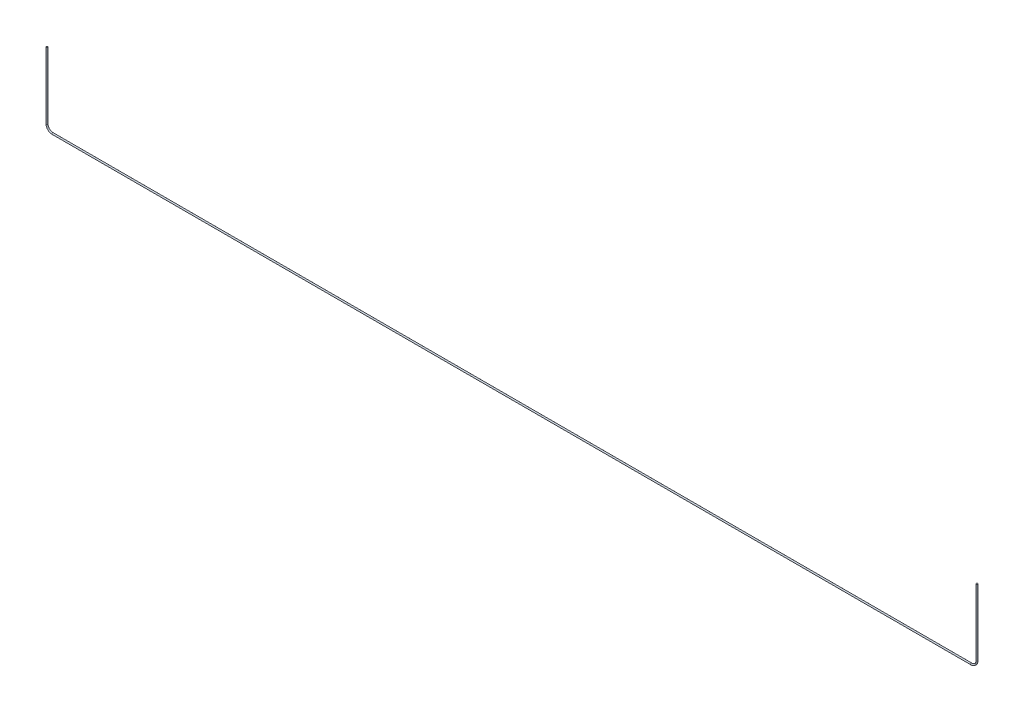
ISO-10303-21;
HEADER;
FILE_DESCRIPTION(('STEP AP214'),'2;1');
FILE_NAME('part.step','',(''),(''),'','','');
FILE_SCHEMA(('AUTOMOTIVE_DESIGN { 1 0 10303 214 1 1 1 1 }'));
ENDSEC;
DATA;
#1=APPLICATION_CONTEXT('core data for automotive mechanical design processes');
#2=APPLICATION_PROTOCOL_DEFINITION('international standard','automotive_design',2000,#1);
#3=PRODUCT_CONTEXT('',#1,'mechanical');
#4=PRODUCT('Part','Part','',(#3));
#5=PRODUCT_RELATED_PRODUCT_CATEGORY('part','',(#4));
#6=PRODUCT_DEFINITION_FORMATION('','',#4);
#7=PRODUCT_DEFINITION_CONTEXT('part definition',#1,'design');
#8=PRODUCT_DEFINITION('design','',#6,#7);
#9=PRODUCT_DEFINITION_SHAPE('','',#8);
#10=(LENGTH_UNIT() NAMED_UNIT(*) SI_UNIT(.MILLI.,.METRE.));
#11=(NAMED_UNIT(*) PLANE_ANGLE_UNIT() SI_UNIT($,.RADIAN.));
#12=(NAMED_UNIT(*) SI_UNIT($,.STERADIAN.) SOLID_ANGLE_UNIT());
#13=UNCERTAINTY_MEASURE_WITH_UNIT(LENGTH_MEASURE(1.E-05),#10,'distance_accuracy_value','');
#14=(GEOMETRIC_REPRESENTATION_CONTEXT(3) GLOBAL_UNCERTAINTY_ASSIGNED_CONTEXT((#13)) GLOBAL_UNIT_ASSIGNED_CONTEXT((#10,
#11,#12)) REPRESENTATION_CONTEXT('',''));
#15=CARTESIAN_POINT('',(0.,0.,0.));
#16=DIRECTION('',(0.,0.,1.));
#17=DIRECTION('',(1.,0.,0.));
#18=AXIS2_PLACEMENT_3D('',#15,#16,#17);
#19=CARTESIAN_POINT('',(-4120.,639.999999999999,0.));
#20=DIRECTION('',(0.,1.,0.));
#21=DIRECTION('',(0.,0.,-1.));
#22=AXIS2_PLACEMENT_3D('',#19,#20,#21);
#23=PLANE('',#22);
#24=CARTESIAN_POINT('',(-4120.,639.999999999999,0.));
#25=DIRECTION('',(0.,1.,0.));
#26=DIRECTION('',(0.,0.,-1.));
#27=AXIS2_PLACEMENT_3D('',#24,#25,#26);
#28=CIRCLE('',#27,6.3500000000003);
#29=CARTESIAN_POINT('',(-4120.,639.999999999999,-6.3500000000003));
#30=VERTEX_POINT('',#29);
#31=EDGE_CURVE('E69',#30,#30,#28,.T.);
#32=ORIENTED_EDGE('',*,*,#31,.T.);
#33=EDGE_LOOP('',(#32));
#34=FACE_BOUND('',#33,.T.);
#35=ADVANCED_FACE('F47',(#34),#23,.T.);
#36=CARTESIAN_POINT('',(4120.,639.999999999999,0.));
#37=DIRECTION('',(0.,-1.,0.));
#38=DIRECTION('',(0.,0.,-1.));
#39=AXIS2_PLACEMENT_3D('',#36,#37,#38);
#40=PLANE('',#39);
#41=CARTESIAN_POINT('',(4120.,639.999999999999,0.));
#42=DIRECTION('',(0.,-1.,0.));
#43=DIRECTION('',(0.,0.,-1.));
#44=AXIS2_PLACEMENT_3D('',#41,#42,#43);
#45=CIRCLE('',#44,6.3500000000003);
#46=CARTESIAN_POINT('',(4120.,639.999999999999,-6.3500000000003));
#47=VERTEX_POINT('',#46);
#48=EDGE_CURVE('E11',#47,#47,#45,.T.);
#49=ORIENTED_EDGE('',*,*,#48,.F.);
#50=EDGE_LOOP('',(#49));
#51=FACE_BOUND('',#50,.T.);
#52=ADVANCED_FACE('F77',(#51),#40,.F.);
#53=CARTESIAN_POINT('',(-4120.,639.999999999999,0.));
#54=DIRECTION('',(0.,-1.,0.));
#55=DIRECTION('',(0.,0.,-1.));
#56=AXIS2_PLACEMENT_3D('',#53,#54,#55);
#57=CYLINDRICAL_SURFACE('',#56,6.3500000000003);
#58=CARTESIAN_POINT('',(-4120.,50.0000000000004,0.));
#59=DIRECTION('',(0.,1.,0.));
#60=DIRECTION('',(0.,0.,-1.));
#61=AXIS2_PLACEMENT_3D('',#58,#59,#60);
#62=CIRCLE('',#61,6.3500000000003);
#63=CARTESIAN_POINT('',(-4126.35,50.0000000000004,0.));
#64=VERTEX_POINT('',#63);
#65=EDGE_CURVE('E66',#64,#64,#62,.T.);
#66=ORIENTED_EDGE('',*,*,#65,.T.);
#67=EDGE_LOOP('',(#66));
#68=FACE_BOUND('',#67,.T.);
#69=ORIENTED_EDGE('',*,*,#31,.F.);
#70=EDGE_LOOP('',(#69));
#71=FACE_BOUND('',#70,.T.);
#72=ADVANCED_FACE('F74',(#68,#71),#57,.T.);
#73=CARTESIAN_POINT('',(-4070.,50.,0.));
#74=DIRECTION('',(0.,0.,1.));
#75=DIRECTION('',(1.,0.,0.));
#76=AXIS2_PLACEMENT_3D('',#73,#74,#75);
#77=TOROIDAL_SURFACE('',#76,49.9999999999998,6.3500000000003);
#78=CARTESIAN_POINT('',(-4070.,0.,0.));
#79=DIRECTION('',(-1.,0.,0.));
#80=DIRECTION('',(0.,0.,-1.));
#81=AXIS2_PLACEMENT_3D('',#78,#79,#80);
#82=CIRCLE('',#81,6.3500000000003);
#83=CARTESIAN_POINT('',(-4070.,-6.35000000000012,0.));
#84=VERTEX_POINT('',#83);
#85=EDGE_CURVE('E61',#84,#84,#82,.T.);
#86=CARTESIAN_POINT('',(-4070.,50.,0.));
#87=DIRECTION('',(0.,0.,1.));
#88=DIRECTION('',(1.,0.,0.));
#89=AXIS2_PLACEMENT_3D('',#86,#87,#88);
#90=CIRCLE('',#89,56.3500000000001);
#91=EDGE_CURVE('',#64,#84,#90,.T.);
#92=ORIENTED_EDGE('',*,*,#65,.F.);
#93=ORIENTED_EDGE('',*,*,#85,.T.);
#94=ORIENTED_EDGE('',*,*,#91,.T.);
#95=ORIENTED_EDGE('',*,*,#91,.F.);
#96=EDGE_LOOP('',(#92,#94,#93,#95));
#97=FACE_BOUND('',#96,.T.);
#98=ADVANCED_FACE('F76',(#97),#77,.T.);
#99=CARTESIAN_POINT('',(-4070.,0.,0.));
#100=DIRECTION('',(1.,0.,0.));
#101=DIRECTION('',(0.,0.,-1.));
#102=AXIS2_PLACEMENT_3D('',#99,#100,#101);
#103=CYLINDRICAL_SURFACE('',#102,6.3500000000003);
#104=CARTESIAN_POINT('',(4070.,0.,0.));
#105=DIRECTION('',(-1.,0.,0.));
#106=DIRECTION('',(0.,0.,-1.));
#107=AXIS2_PLACEMENT_3D('',#104,#105,#106);
#108=CIRCLE('',#107,6.3500000000003);
#109=CARTESIAN_POINT('',(4070.,-6.35000000000029,0.));
#110=VERTEX_POINT('',#109);
#111=EDGE_CURVE('E57',#110,#110,#108,.T.);
#112=ORIENTED_EDGE('',*,*,#111,.T.);
#113=EDGE_LOOP('',(#112));
#114=FACE_BOUND('',#113,.T.);
#115=ORIENTED_EDGE('',*,*,#85,.F.);
#116=EDGE_LOOP('',(#115));
#117=FACE_BOUND('',#116,.T.);
#118=ADVANCED_FACE('F84',(#114,#117),#103,.T.);
#119=CARTESIAN_POINT('',(4070.,50.,0.));
#120=DIRECTION('',(0.,0.,1.));
#121=DIRECTION('',(1.,0.,0.));
#122=AXIS2_PLACEMENT_3D('',#119,#120,#121);
#123=TOROIDAL_SURFACE('',#122,50.,6.3500000000003);
#124=CARTESIAN_POINT('',(4120.,50.,0.));
#125=DIRECTION('',(0.,-1.,0.));
#126=DIRECTION('',(0.,0.,-1.));
#127=AXIS2_PLACEMENT_3D('',#124,#125,#126);
#128=CIRCLE('',#127,6.3500000000003);
#129=CARTESIAN_POINT('',(4126.35,50.,0.));
#130=VERTEX_POINT('',#129);
#131=EDGE_CURVE('E53',#130,#130,#128,.T.);
#132=CARTESIAN_POINT('',(4070.,50.,0.));
#133=DIRECTION('',(0.,0.,1.));
#134=DIRECTION('',(1.,0.,0.));
#135=AXIS2_PLACEMENT_3D('',#132,#133,#134);
#136=CIRCLE('',#135,56.3500000000003);
#137=EDGE_CURVE('',#110,#130,#136,.T.);
#138=ORIENTED_EDGE('',*,*,#111,.F.);
#139=ORIENTED_EDGE('',*,*,#131,.T.);
#140=ORIENTED_EDGE('',*,*,#137,.T.);
#141=ORIENTED_EDGE('',*,*,#137,.F.);
#142=EDGE_LOOP('',(#138,#140,#139,#141));
#143=FACE_BOUND('',#142,.T.);
#144=ADVANCED_FACE('F90',(#143),#123,.T.);
#145=CARTESIAN_POINT('',(4120.,50.,0.));
#146=DIRECTION('',(0.,1.,0.));
#147=DIRECTION('',(0.,0.,1.));
#148=AXIS2_PLACEMENT_3D('',#145,#146,#147);
#149=CYLINDRICAL_SURFACE('',#148,6.3500000000003);
#150=ORIENTED_EDGE('',*,*,#48,.T.);
#151=EDGE_LOOP('',(#150));
#152=FACE_BOUND('',#151,.T.);
#153=ORIENTED_EDGE('',*,*,#131,.F.);
#154=EDGE_LOOP('',(#153));
#155=FACE_BOUND('',#154,.T.);
#156=ADVANCED_FACE('F88',(#152,#155),#149,.T.);
#157=CLOSED_SHELL('',(#35,#52,#72,#98,#118,#144,#156));
#158=MANIFOLD_SOLID_BREP('B2',#157);
#159=ADVANCED_BREP_SHAPE_REPRESENTATION('',(#18,#158),#14);
#160=SHAPE_DEFINITION_REPRESENTATION(#9,#159);
ENDSEC;
END-ISO-10303-21;
